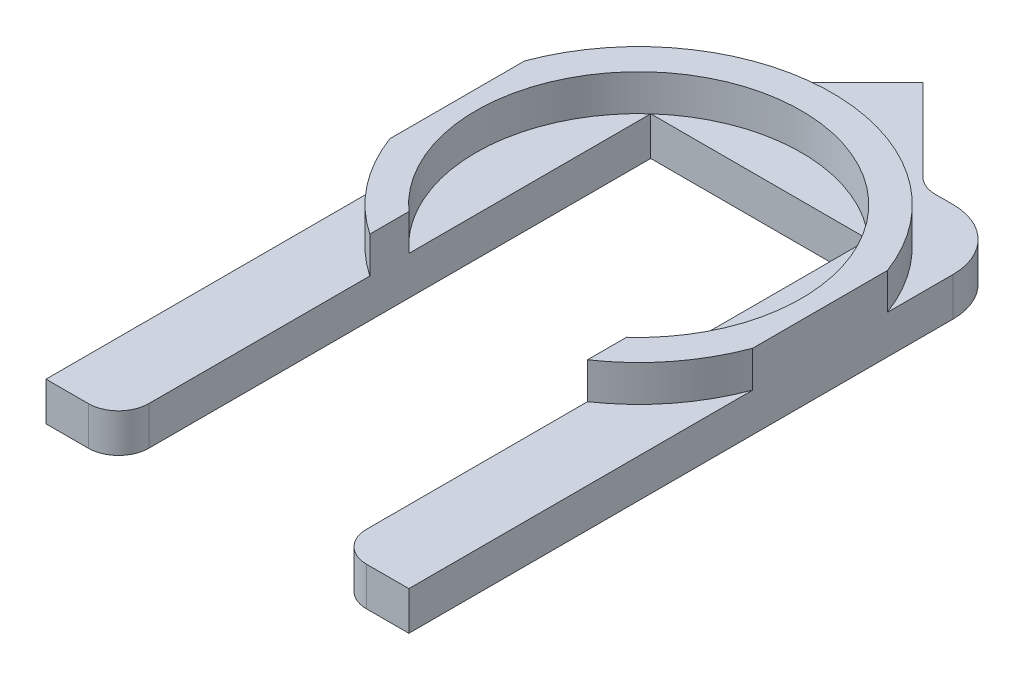
ISO-10303-21;
HEADER;
FILE_DESCRIPTION(('STEP AP214'),'2;1');
FILE_NAME('part.step','',(''),(''),'','','');
FILE_SCHEMA(('AUTOMOTIVE_DESIGN { 1 0 10303 214 1 1 1 1 }'));
ENDSEC;
DATA;
#1=APPLICATION_CONTEXT('core data for automotive mechanical design processes');
#2=APPLICATION_PROTOCOL_DEFINITION('international standard','automotive_design',2000,#1);
#3=PRODUCT_CONTEXT('',#1,'mechanical');
#4=PRODUCT('Part','Part','',(#3));
#5=PRODUCT_RELATED_PRODUCT_CATEGORY('part','',(#4));
#6=PRODUCT_DEFINITION_FORMATION('','',#4);
#7=PRODUCT_DEFINITION_CONTEXT('part definition',#1,'design');
#8=PRODUCT_DEFINITION('design','',#6,#7);
#9=PRODUCT_DEFINITION_SHAPE('','',#8);
#10=(LENGTH_UNIT() NAMED_UNIT(*) SI_UNIT(.MILLI.,.METRE.));
#11=(NAMED_UNIT(*) PLANE_ANGLE_UNIT() SI_UNIT($,.RADIAN.));
#12=(NAMED_UNIT(*) SI_UNIT($,.STERADIAN.) SOLID_ANGLE_UNIT());
#13=UNCERTAINTY_MEASURE_WITH_UNIT(LENGTH_MEASURE(1.E-05),#10,'distance_accuracy_value','');
#14=(GEOMETRIC_REPRESENTATION_CONTEXT(3) GLOBAL_UNCERTAINTY_ASSIGNED_CONTEXT((#13)) GLOBAL_UNIT_ASSIGNED_CONTEXT((#10,
#11,#12)) REPRESENTATION_CONTEXT('',''));
#15=CARTESIAN_POINT('',(0.,0.,0.));
#16=DIRECTION('',(0.,0.,1.));
#17=DIRECTION('',(1.,0.,0.));
#18=AXIS2_PLACEMENT_3D('',#15,#16,#17);
#19=CARTESIAN_POINT('',(0.,3.2,0.));
#20=DIRECTION('',(0.,-1.,0.));
#21=DIRECTION('',(0.,0.,-1.));
#22=AXIS2_PLACEMENT_3D('',#19,#20,#21);
#23=PLANE('',#22);
#24=DIRECTION('',(1.,0.,0.));
#25=VECTOR('',#24,1.);
#26=CARTESIAN_POINT('',(-15.,3.2,25.));
#27=LINE('',#26,#25);
#28=CARTESIAN_POINT('',(-15.,3.2,25.));
#29=VERTEX_POINT('',#28);
#30=CARTESIAN_POINT('',(-11.5,3.2,25.));
#31=VERTEX_POINT('',#30);
#32=EDGE_CURVE('E254',#29,#31,#27,.T.);
#33=ORIENTED_EDGE('',*,*,#32,.T.);
#34=CARTESIAN_POINT('',(-11.5,3.2,22.5));
#35=DIRECTION('',(0.,-1.,0.));
#36=DIRECTION('',(0.,0.,-1.));
#37=AXIS2_PLACEMENT_3D('',#34,#35,#36);
#38=CIRCLE('',#37,2.5);
#39=CARTESIAN_POINT('',(-8.99999999999999,3.2,22.5));
#40=VERTEX_POINT('',#39);
#41=EDGE_CURVE('E62',#31,#40,#38,.F.);
#42=ORIENTED_EDGE('',*,*,#41,.T.);
#43=DIRECTION('',(0.,0.,-1.));
#44=VECTOR('',#43,1.);
#45=CARTESIAN_POINT('',(-8.99999999999999,3.2,25.));
#46=LINE('',#45,#44);
#47=CARTESIAN_POINT('',(-8.99999999999999,3.2,4.22875655532297));
#48=VERTEX_POINT('',#47);
#49=EDGE_CURVE('E258',#40,#48,#46,.T.);
#50=ORIENTED_EDGE('',*,*,#49,.T.);
#51=CARTESIAN_POINT('',(0.,3.2,-8.99999999999999));
#52=DIRECTION('',(0.,1.,0.));
#53=DIRECTION('',(0.,0.,1.));
#54=AXIS2_PLACEMENT_3D('',#51,#52,#53);
#55=CIRCLE('',#54,16.);
#56=CARTESIAN_POINT('',(-15.,3.2,-3.43223563716993));
#57=VERTEX_POINT('',#56);
#58=EDGE_CURVE('E234',#57,#48,#55,.T.);
#59=ORIENTED_EDGE('',*,*,#58,.F.);
#60=DIRECTION('',(0.,0.,1.));
#61=VECTOR('',#60,1.);
#62=CARTESIAN_POINT('',(-15.,3.2,25.));
#63=LINE('',#62,#61);
#64=EDGE_CURVE('E249',#57,#29,#63,.T.);
#65=ORIENTED_EDGE('',*,*,#64,.T.);
#66=EDGE_LOOP('',(#33,#42,#50,#59,#65));
#67=FACE_BOUND('',#66,.T.);
#68=ADVANCED_FACE('F39',(#67),#23,.F.);
#69=DIRECTION('',(-0.70710678118654,0.,0.707106781186555));
#70=VECTOR('',#69,1.);
#71=CARTESIAN_POINT('',(0.,3.2,-32.5));
#72=LINE('',#71,#70);
#73=CARTESIAN_POINT('',(0.,3.2,-32.5));
#74=VERTEX_POINT('',#73);
#75=CARTESIAN_POINT('',(-6.76776695296624,3.2,-25.7322330470336));
#76=VERTEX_POINT('',#75);
#77=EDGE_CURVE('E283',#74,#76,#72,.T.);
#78=ORIENTED_EDGE('',*,*,#77,.T.);
#79=CARTESIAN_POINT('',(-8.53553390593262,3.2,-27.5));
#80=DIRECTION('',(0.,-1.,0.));
#81=DIRECTION('',(0.,0.,-1.));
#82=AXIS2_PLACEMENT_3D('',#79,#80,#81);
#83=CIRCLE('',#82,2.5);
#84=CARTESIAN_POINT('',(-8.53553390593262,3.2,-25.));
#85=VERTEX_POINT('',#84);
#86=EDGE_CURVE('E11',#76,#85,#83,.T.);
#87=ORIENTED_EDGE('',*,*,#86,.T.);
#88=DIRECTION('',(-1.,0.,0.));
#89=VECTOR('',#88,1.);
#90=CARTESIAN_POINT('',(-7.49999999999987,3.2,-25.));
#91=LINE('',#90,#89);
#92=CARTESIAN_POINT('',(-9.99999999999999,3.2,-25.));
#93=VERTEX_POINT('',#92);
#94=EDGE_CURVE('E246',#85,#93,#91,.T.);
#95=ORIENTED_EDGE('',*,*,#94,.T.);
#96=CARTESIAN_POINT('',(-9.99999999999999,3.2,-20.));
#97=DIRECTION('',(0.,-1.,0.));
#98=DIRECTION('',(0.,0.,-1.));
#99=AXIS2_PLACEMENT_3D('',#96,#97,#98);
#100=CIRCLE('',#99,5.);
#101=CARTESIAN_POINT('',(-15.,3.2,-20.));
#102=VERTEX_POINT('',#101);
#103=EDGE_CURVE('E359',#93,#102,#100,.F.);
#104=ORIENTED_EDGE('',*,*,#103,.T.);
#105=CARTESIAN_POINT('',(-15.,3.2,-14.56776436283));
#106=VERTEX_POINT('',#105);
#107=EDGE_CURVE('E251',#102,#106,#63,.T.);
#108=ORIENTED_EDGE('',*,*,#107,.T.);
#109=CARTESIAN_POINT('',(0.,3.2,-8.99999999999999));
#110=DIRECTION('',(0.,1.,0.));
#111=DIRECTION('',(0.,0.,1.));
#112=AXIS2_PLACEMENT_3D('',#109,#110,#111);
#113=CIRCLE('',#112,16.);
#114=CARTESIAN_POINT('',(15.,3.2,-14.56776436283));
#115=VERTEX_POINT('',#114);
#116=EDGE_CURVE('E231',#115,#106,#113,.T.);
#117=ORIENTED_EDGE('',*,*,#116,.F.);
#118=DIRECTION('',(0.,0.,-1.));
#119=VECTOR('',#118,1.);
#120=CARTESIAN_POINT('',(15.,3.2,25.));
#121=LINE('',#120,#119);
#122=CARTESIAN_POINT('',(15.,3.2,-20.));
#123=VERTEX_POINT('',#122);
#124=EDGE_CURVE('E272',#115,#123,#121,.T.);
#125=ORIENTED_EDGE('',*,*,#124,.T.);
#126=CARTESIAN_POINT('',(10.,3.2,-20.));
#127=DIRECTION('',(0.,-1.,0.));
#128=DIRECTION('',(0.,0.,-1.));
#129=AXIS2_PLACEMENT_3D('',#126,#127,#128);
#130=CIRCLE('',#129,5.);
#131=CARTESIAN_POINT('',(10.,3.2,-25.));
#132=VERTEX_POINT('',#131);
#133=EDGE_CURVE('E356',#123,#132,#130,.F.);
#134=ORIENTED_EDGE('',*,*,#133,.T.);
#135=DIRECTION('',(-1.,0.,0.));
#136=VECTOR('',#135,1.);
#137=CARTESIAN_POINT('',(15.,3.2,-25.));
#138=LINE('',#137,#136);
#139=CARTESIAN_POINT('',(8.53553390593285,3.2,-25.));
#140=VERTEX_POINT('',#139);
#141=EDGE_CURVE('E276',#132,#140,#138,.T.);
#142=ORIENTED_EDGE('',*,*,#141,.T.);
#143=CARTESIAN_POINT('',(8.53553390593286,3.2,-27.5));
#144=DIRECTION('',(0.,-1.,0.));
#145=DIRECTION('',(0.,0.,-1.));
#146=AXIS2_PLACEMENT_3D('',#143,#144,#145);
#147=CIRCLE('',#146,2.5);
#148=CARTESIAN_POINT('',(6.7677669529665,3.2,-25.7322330470336));
#149=VERTEX_POINT('',#148);
#150=EDGE_CURVE('E410',#140,#149,#147,.T.);
#151=ORIENTED_EDGE('',*,*,#150,.T.);
#152=DIRECTION('',(-0.707106781186554,0.,-0.707106781186541));
#153=VECTOR('',#152,1.);
#154=CARTESIAN_POINT('',(0.,3.2,-32.5));
#155=LINE('',#154,#153);
#156=EDGE_CURVE('E280',#149,#74,#155,.T.);
#157=ORIENTED_EDGE('',*,*,#156,.T.);
#158=EDGE_LOOP('',(#78,#87,#95,#104,#108,#117,#125,#134,#142,#151,#157));
#159=FACE_BOUND('',#158,.T.);
#160=ADVANCED_FACE('F430',(#159),#23,.F.);
#161=DIRECTION('',(0.,0.,1.));
#162=VECTOR('',#161,1.);
#163=CARTESIAN_POINT('',(9.00000000000001,3.2,25.));
#164=LINE('',#163,#162);
#165=CARTESIAN_POINT('',(9.00000000000001,3.2,4.22875655532297));
#166=VERTEX_POINT('',#165);
#167=CARTESIAN_POINT('',(9.00000000000001,3.2,22.5));
#168=VERTEX_POINT('',#167);
#169=EDGE_CURVE('E265',#166,#168,#164,.T.);
#170=ORIENTED_EDGE('',*,*,#169,.T.);
#171=CARTESIAN_POINT('',(11.5,3.2,22.5));
#172=DIRECTION('',(0.,-1.,0.));
#173=DIRECTION('',(0.,0.,-1.));
#174=AXIS2_PLACEMENT_3D('',#171,#172,#173);
#175=CIRCLE('',#174,2.5);
#176=CARTESIAN_POINT('',(11.5,3.2,25.));
#177=VERTEX_POINT('',#176);
#178=EDGE_CURVE('E396',#168,#177,#175,.F.);
#179=ORIENTED_EDGE('',*,*,#178,.T.);
#180=DIRECTION('',(1.,0.,0.));
#181=VECTOR('',#180,1.);
#182=CARTESIAN_POINT('',(9.00000000000001,3.2,25.));
#183=LINE('',#182,#181);
#184=CARTESIAN_POINT('',(15.,3.2,25.));
#185=VERTEX_POINT('',#184);
#186=EDGE_CURVE('E269',#177,#185,#183,.T.);
#187=ORIENTED_EDGE('',*,*,#186,.T.);
#188=CARTESIAN_POINT('',(15.,3.2,-3.43223563716999));
#189=VERTEX_POINT('',#188);
#190=EDGE_CURVE('E273',#185,#189,#121,.T.);
#191=ORIENTED_EDGE('',*,*,#190,.T.);
#192=CARTESIAN_POINT('',(0.,3.2,-8.99999999999999));
#193=DIRECTION('',(0.,1.,0.));
#194=DIRECTION('',(0.,0.,1.));
#195=AXIS2_PLACEMENT_3D('',#192,#193,#194);
#196=CIRCLE('',#195,16.);
#197=EDGE_CURVE('E488',#166,#189,#196,.T.);
#198=ORIENTED_EDGE('',*,*,#197,.F.);
#199=EDGE_LOOP('',(#170,#179,#187,#191,#198));
#200=FACE_BOUND('',#199,.T.);
#201=ADVANCED_FACE('F548',(#200),#23,.F.);
#202=CARTESIAN_POINT('',(0.,3.2,-8.99999999999999));
#203=DIRECTION('',(0.,-1.,0.));
#204=DIRECTION('',(0.,0.,1.));
#205=AXIS2_PLACEMENT_3D('',#202,#203,#204);
#206=CIRCLE('',#205,13.4536240470737);
#207=CARTESIAN_POINT('',(-8.99999999999999,3.2,1.00000000000002));
#208=VERTEX_POINT('',#207);
#209=CARTESIAN_POINT('',(-9.,3.2,-19.));
#210=VERTEX_POINT('',#209);
#211=EDGE_CURVE('E483',#208,#210,#206,.T.);
#212=ORIENTED_EDGE('',*,*,#211,.F.);
#213=EDGE_CURVE('E257',#208,#210,#46,.T.);
#214=ORIENTED_EDGE('',*,*,#213,.T.);
#215=EDGE_LOOP('',(#212,#214));
#216=FACE_BOUND('',#215,.T.);
#217=ADVANCED_FACE('F558',(#216),#23,.F.);
#218=CARTESIAN_POINT('',(9.,3.2,-19.));
#219=VERTEX_POINT('',#218);
#220=EDGE_CURVE('E345',#210,#219,#206,.T.);
#221=ORIENTED_EDGE('',*,*,#220,.F.);
#222=DIRECTION('',(1.,0.,0.));
#223=VECTOR('',#222,1.);
#224=CARTESIAN_POINT('',(-9.,3.2,-19.));
#225=LINE('',#224,#223);
#226=EDGE_CURVE('E261',#210,#219,#225,.T.);
#227=ORIENTED_EDGE('',*,*,#226,.T.);
#228=EDGE_LOOP('',(#221,#227));
#229=FACE_BOUND('',#228,.T.);
#230=ADVANCED_FACE('F552',(#229),#23,.F.);
#231=CARTESIAN_POINT('',(9.00000000000001,3.2,1.00000000000001));
#232=VERTEX_POINT('',#231);
#233=EDGE_CURVE('E339',#219,#232,#206,.T.);
#234=ORIENTED_EDGE('',*,*,#233,.F.);
#235=EDGE_CURVE('E266',#219,#232,#164,.T.);
#236=ORIENTED_EDGE('',*,*,#235,.T.);
#237=EDGE_LOOP('',(#234,#236));
#238=FACE_BOUND('',#237,.T.);
#239=ADVANCED_FACE('F544',(#238),#23,.F.);
#240=CARTESIAN_POINT('',(-7.49999999999987,3.2,-25.));
#241=DIRECTION('',(0.,0.,1.));
#242=DIRECTION('',(1.,0.,0.));
#243=AXIS2_PLACEMENT_3D('',#240,#241,#242);
#244=PLANE('',#243);
#245=ORIENTED_EDGE('',*,*,#94,.F.);
#246=DIRECTION('',(0.,-1.,0.));
#247=VECTOR('',#246,1.);
#248=CARTESIAN_POINT('',(-8.53553390593262,0.,-25.));
#249=LINE('',#248,#247);
#250=CARTESIAN_POINT('',(-8.53553390593262,0.,-25.));
#251=VERTEX_POINT('',#250);
#252=EDGE_CURVE('E376',#85,#251,#249,.T.);
#253=ORIENTED_EDGE('',*,*,#252,.T.);
#254=DIRECTION('',(-1.,0.,0.));
#255=VECTOR('',#254,1.);
#256=CARTESIAN_POINT('',(-7.49999999999987,0.,-25.));
#257=LINE('',#256,#255);
#258=CARTESIAN_POINT('',(-9.99999999999999,0.,-25.));
#259=VERTEX_POINT('',#258);
#260=EDGE_CURVE('E236',#251,#259,#257,.T.);
#261=ORIENTED_EDGE('',*,*,#260,.T.);
#262=DIRECTION('',(0.,-1.,0.));
#263=VECTOR('',#262,1.);
#264=CARTESIAN_POINT('',(-9.99999999999999,3.2,-25.));
#265=LINE('',#264,#263);
#266=EDGE_CURVE('E352',#259,#93,#265,.F.);
#267=ORIENTED_EDGE('',*,*,#266,.T.);
#268=EDGE_LOOP('',(#245,#253,#261,#267));
#269=FACE_BOUND('',#268,.T.);
#270=ADVANCED_FACE('F432',(#269),#244,.F.);
#271=CARTESIAN_POINT('',(-15.,3.2,25.));
#272=DIRECTION('',(1.,0.,0.));
#273=DIRECTION('',(0.,0.,-1.));
#274=AXIS2_PLACEMENT_3D('',#271,#272,#273);
#275=PLANE('',#274);
#276=ORIENTED_EDGE('',*,*,#107,.F.);
#277=DIRECTION('',(0.,-1.,0.));
#278=VECTOR('',#277,1.);
#279=CARTESIAN_POINT('',(-15.,3.2,-20.));
#280=LINE('',#279,#278);
#281=CARTESIAN_POINT('',(-15.,0.,-20.));
#282=VERTEX_POINT('',#281);
#283=EDGE_CURVE('E340',#102,#282,#280,.T.);
#284=ORIENTED_EDGE('',*,*,#283,.T.);
#285=DIRECTION('',(0.,0.,1.));
#286=VECTOR('',#285,1.);
#287=CARTESIAN_POINT('',(-15.,0.,25.));
#288=LINE('',#287,#286);
#289=CARTESIAN_POINT('',(-15.,0.,25.));
#290=VERTEX_POINT('',#289);
#291=EDGE_CURVE('E240',#282,#290,#288,.T.);
#292=ORIENTED_EDGE('',*,*,#291,.T.);
#293=DIRECTION('',(0.,-1.,0.));
#294=VECTOR('',#293,1.);
#295=CARTESIAN_POINT('',(-15.,3.2,25.));
#296=LINE('',#295,#294);
#297=EDGE_CURVE('E335',#29,#290,#296,.T.);
#298=ORIENTED_EDGE('',*,*,#297,.F.);
#299=ORIENTED_EDGE('',*,*,#64,.F.);
#300=DIRECTION('',(0.,-1.,0.));
#301=VECTOR('',#300,1.);
#302=CARTESIAN_POINT('',(-15.,6.2,-3.43223563716993));
#303=LINE('',#302,#301);
#304=CARTESIAN_POINT('',(-15.,6.2,-3.43223563716993));
#305=VERTEX_POINT('',#304);
#306=EDGE_CURVE('E450',#305,#57,#303,.T.);
#307=ORIENTED_EDGE('',*,*,#306,.F.);
#308=DIRECTION('',(0.,0.,1.));
#309=VECTOR('',#308,1.);
#310=CARTESIAN_POINT('',(-15.,6.2,-14.56776436283));
#311=LINE('',#310,#309);
#312=CARTESIAN_POINT('',(-15.,6.2,-14.56776436283));
#313=VERTEX_POINT('',#312);
#314=EDGE_CURVE('E226',#313,#305,#311,.T.);
#315=ORIENTED_EDGE('',*,*,#314,.F.);
#316=DIRECTION('',(0.,-1.,0.));
#317=VECTOR('',#316,1.);
#318=CARTESIAN_POINT('',(-15.,6.2,-14.56776436283));
#319=LINE('',#318,#317);
#320=EDGE_CURVE('E445',#313,#106,#319,.T.);
#321=ORIENTED_EDGE('',*,*,#320,.T.);
#322=EDGE_LOOP('',(#276,#284,#292,#298,#299,#307,#315,#321));
#323=FACE_BOUND('',#322,.T.);
#324=ADVANCED_FACE('F442',(#323),#275,.F.);
#325=CARTESIAN_POINT('',(-15.,3.2,25.));
#326=DIRECTION('',(0.,0.,-1.));
#327=DIRECTION('',(-1.,0.,0.));
#328=AXIS2_PLACEMENT_3D('',#325,#326,#327);
#329=PLANE('',#328);
#330=DIRECTION('',(1.,0.,0.));
#331=VECTOR('',#330,1.);
#332=CARTESIAN_POINT('',(-15.,0.,25.));
#333=LINE('',#332,#331);
#334=CARTESIAN_POINT('',(-11.5,0.,25.));
#335=VERTEX_POINT('',#334);
#336=EDGE_CURVE('E290',#290,#335,#333,.T.);
#337=ORIENTED_EDGE('',*,*,#336,.T.);
#338=DIRECTION('',(0.,-1.,0.));
#339=VECTOR('',#338,1.);
#340=CARTESIAN_POINT('',(-11.5,3.2,25.));
#341=LINE('',#340,#339);
#342=EDGE_CURVE('E55',#335,#31,#341,.F.);
#343=ORIENTED_EDGE('',*,*,#342,.T.);
#344=ORIENTED_EDGE('',*,*,#32,.F.);
#345=ORIENTED_EDGE('',*,*,#297,.T.);
#346=EDGE_LOOP('',(#337,#343,#344,#345));
#347=FACE_BOUND('',#346,.T.);
#348=ADVANCED_FACE('F532',(#347),#329,.F.);
#349=CARTESIAN_POINT('',(-8.99999999999999,3.2,25.));
#350=DIRECTION('',(-1.,0.,0.));
#351=DIRECTION('',(0.,0.,1.));
#352=AXIS2_PLACEMENT_3D('',#349,#350,#351);
#353=PLANE('',#352);
#354=ORIENTED_EDGE('',*,*,#49,.F.);
#355=DIRECTION('',(0.,-1.,0.));
#356=VECTOR('',#355,1.);
#357=CARTESIAN_POINT('',(-8.99999999999999,3.2,22.5));
#358=LINE('',#357,#356);
#359=CARTESIAN_POINT('',(-8.99999999999999,0.,22.5));
#360=VERTEX_POINT('',#359);
#361=EDGE_CURVE('E399',#40,#360,#358,.T.);
#362=ORIENTED_EDGE('',*,*,#361,.T.);
#363=DIRECTION('',(0.,0.,-1.));
#364=VECTOR('',#363,1.);
#365=CARTESIAN_POINT('',(-8.99999999999999,0.,25.));
#366=LINE('',#365,#364);
#367=CARTESIAN_POINT('',(-9.,0.,-19.));
#368=VERTEX_POINT('',#367);
#369=EDGE_CURVE('E293',#360,#368,#366,.T.);
#370=ORIENTED_EDGE('',*,*,#369,.T.);
#371=DIRECTION('',(0.,-1.,0.));
#372=VECTOR('',#371,1.);
#373=CARTESIAN_POINT('',(-9.,3.2,-19.));
#374=LINE('',#373,#372);
#375=EDGE_CURVE('E331',#210,#368,#374,.T.);
#376=ORIENTED_EDGE('',*,*,#375,.F.);
#377=ORIENTED_EDGE('',*,*,#213,.F.);
#378=DIRECTION('',(0.,-1.,0.));
#379=VECTOR('',#378,1.);
#380=CARTESIAN_POINT('',(-8.99999999999999,6.2,1.00000000000002));
#381=LINE('',#380,#379);
#382=CARTESIAN_POINT('',(-8.99999999999999,6.2,1.00000000000002));
#383=VERTEX_POINT('',#382);
#384=EDGE_CURVE('E216',#383,#208,#381,.T.);
#385=ORIENTED_EDGE('',*,*,#384,.F.);
#386=DIRECTION('',(0.,0.,-1.));
#387=VECTOR('',#386,1.);
#388=CARTESIAN_POINT('',(-8.99999999999999,6.2,4.22875655532297));
#389=LINE('',#388,#387);
#390=CARTESIAN_POINT('',(-8.99999999999999,6.2,4.22875655532297));
#391=VERTEX_POINT('',#390);
#392=EDGE_CURVE('E208',#391,#383,#389,.T.);
#393=ORIENTED_EDGE('',*,*,#392,.F.);
#394=DIRECTION('',(0.,-1.,0.));
#395=VECTOR('',#394,1.);
#396=CARTESIAN_POINT('',(-8.99999999999999,6.2,4.22875655532297));
#397=LINE('',#396,#395);
#398=EDGE_CURVE('E212',#391,#48,#397,.T.);
#399=ORIENTED_EDGE('',*,*,#398,.T.);
#400=EDGE_LOOP('',(#354,#362,#370,#376,#377,#385,#393,#399));
#401=FACE_BOUND('',#400,.T.);
#402=ADVANCED_FACE('F210',(#401),#353,.F.);
#403=CARTESIAN_POINT('',(-9.,3.2,-19.));
#404=DIRECTION('',(0.,0.,-1.));
#405=DIRECTION('',(-1.,0.,0.));
#406=AXIS2_PLACEMENT_3D('',#403,#404,#405);
#407=PLANE('',#406);
#408=DIRECTION('',(1.,0.,0.));
#409=VECTOR('',#408,1.);
#410=CARTESIAN_POINT('',(-9.,0.,-19.));
#411=LINE('',#410,#409);
#412=CARTESIAN_POINT('',(9.,0.,-19.));
#413=VERTEX_POINT('',#412);
#414=EDGE_CURVE('E296',#368,#413,#411,.T.);
#415=ORIENTED_EDGE('',*,*,#414,.T.);
#416=DIRECTION('',(0.,-1.,0.));
#417=VECTOR('',#416,1.);
#418=CARTESIAN_POINT('',(9.,3.2,-19.));
#419=LINE('',#418,#417);
#420=EDGE_CURVE('E327',#219,#413,#419,.T.);
#421=ORIENTED_EDGE('',*,*,#420,.F.);
#422=ORIENTED_EDGE('',*,*,#226,.F.);
#423=ORIENTED_EDGE('',*,*,#375,.T.);
#424=EDGE_LOOP('',(#415,#421,#422,#423));
#425=FACE_BOUND('',#424,.T.);
#426=ADVANCED_FACE('F539',(#425),#407,.F.);
#427=CARTESIAN_POINT('',(9.00000000000001,3.2,25.));
#428=DIRECTION('',(1.,0.,0.));
#429=DIRECTION('',(0.,0.,-1.));
#430=AXIS2_PLACEMENT_3D('',#427,#428,#429);
#431=PLANE('',#430);
#432=DIRECTION('',(0.,0.,1.));
#433=VECTOR('',#432,1.);
#434=CARTESIAN_POINT('',(9.00000000000001,0.,25.));
#435=LINE('',#434,#433);
#436=CARTESIAN_POINT('',(9.00000000000001,0.,22.5));
#437=VERTEX_POINT('',#436);
#438=EDGE_CURVE('E299',#413,#437,#435,.T.);
#439=ORIENTED_EDGE('',*,*,#438,.T.);
#440=DIRECTION('',(0.,-1.,0.));
#441=VECTOR('',#440,1.);
#442=CARTESIAN_POINT('',(9.00000000000001,3.2,22.5));
#443=LINE('',#442,#441);
#444=EDGE_CURVE('E393',#437,#168,#443,.F.);
#445=ORIENTED_EDGE('',*,*,#444,.T.);
#446=ORIENTED_EDGE('',*,*,#169,.F.);
#447=DIRECTION('',(0.,-1.,0.));
#448=VECTOR('',#447,1.);
#449=CARTESIAN_POINT('',(9.00000000000001,6.2,4.22875655532296));
#450=LINE('',#449,#448);
#451=CARTESIAN_POINT('',(9.00000000000001,6.2,4.22875655532296));
#452=VERTEX_POINT('',#451);
#453=EDGE_CURVE('E463',#452,#166,#450,.T.);
#454=ORIENTED_EDGE('',*,*,#453,.F.);
#455=DIRECTION('',(0.,0.,1.));
#456=VECTOR('',#455,1.);
#457=CARTESIAN_POINT('',(9.00000000000001,6.2,1.00000000000001));
#458=LINE('',#457,#456);
#459=CARTESIAN_POINT('',(9.00000000000001,6.2,1.00000000000001));
#460=VERTEX_POINT('',#459);
#461=EDGE_CURVE('E475',#460,#452,#458,.T.);
#462=ORIENTED_EDGE('',*,*,#461,.F.);
#463=DIRECTION('',(0.,-1.,0.));
#464=VECTOR('',#463,1.);
#465=CARTESIAN_POINT('',(9.00000000000001,6.2,1.00000000000001));
#466=LINE('',#465,#464);
#467=EDGE_CURVE('E242',#460,#232,#466,.T.);
#468=ORIENTED_EDGE('',*,*,#467,.T.);
#469=ORIENTED_EDGE('',*,*,#235,.F.);
#470=ORIENTED_EDGE('',*,*,#420,.T.);
#471=EDGE_LOOP('',(#439,#445,#446,#454,#462,#468,#469,#470));
#472=FACE_BOUND('',#471,.T.);
#473=ADVANCED_FACE('F472',(#472),#431,.F.);
#474=CARTESIAN_POINT('',(9.00000000000001,3.2,25.));
#475=DIRECTION('',(0.,0.,-1.));
#476=DIRECTION('',(-1.,0.,0.));
#477=AXIS2_PLACEMENT_3D('',#474,#475,#476);
#478=PLANE('',#477);
#479=ORIENTED_EDGE('',*,*,#186,.F.);
#480=DIRECTION('',(0.,-1.,0.));
#481=VECTOR('',#480,1.);
#482=CARTESIAN_POINT('',(11.5,3.2,25.));
#483=LINE('',#482,#481);
#484=CARTESIAN_POINT('',(11.5,0.,25.));
#485=VERTEX_POINT('',#484);
#486=EDGE_CURVE('E383',#177,#485,#483,.T.);
#487=ORIENTED_EDGE('',*,*,#486,.T.);
#488=DIRECTION('',(1.,0.,0.));
#489=VECTOR('',#488,1.);
#490=CARTESIAN_POINT('',(9.00000000000001,0.,25.));
#491=LINE('',#490,#489);
#492=CARTESIAN_POINT('',(15.,0.,25.));
#493=VERTEX_POINT('',#492);
#494=EDGE_CURVE('E303',#485,#493,#491,.T.);
#495=ORIENTED_EDGE('',*,*,#494,.T.);
#496=DIRECTION('',(0.,-1.,0.));
#497=VECTOR('',#496,1.);
#498=CARTESIAN_POINT('',(15.,3.2,25.));
#499=LINE('',#498,#497);
#500=EDGE_CURVE('E323',#185,#493,#499,.T.);
#501=ORIENTED_EDGE('',*,*,#500,.F.);
#502=EDGE_LOOP('',(#479,#487,#495,#501));
#503=FACE_BOUND('',#502,.T.);
#504=ADVANCED_FACE('F579',(#503),#478,.F.);
#505=CARTESIAN_POINT('',(15.,3.2,25.));
#506=DIRECTION('',(-1.,0.,0.));
#507=DIRECTION('',(0.,0.,1.));
#508=AXIS2_PLACEMENT_3D('',#505,#506,#507);
#509=PLANE('',#508);
#510=DIRECTION('',(0.,0.,-1.));
#511=VECTOR('',#510,1.);
#512=CARTESIAN_POINT('',(15.,0.,25.));
#513=LINE('',#512,#511);
#514=CARTESIAN_POINT('',(15.,0.,-20.));
#515=VERTEX_POINT('',#514);
#516=EDGE_CURVE('E306',#493,#515,#513,.T.);
#517=ORIENTED_EDGE('',*,*,#516,.T.);
#518=DIRECTION('',(0.,-1.,0.));
#519=VECTOR('',#518,1.);
#520=CARTESIAN_POINT('',(15.,3.2,-20.));
#521=LINE('',#520,#519);
#522=EDGE_CURVE('E366',#515,#123,#521,.F.);
#523=ORIENTED_EDGE('',*,*,#522,.T.);
#524=ORIENTED_EDGE('',*,*,#124,.F.);
#525=DIRECTION('',(0.,-1.,0.));
#526=VECTOR('',#525,1.);
#527=CARTESIAN_POINT('',(15.,6.2,-14.56776436283));
#528=LINE('',#527,#526);
#529=CARTESIAN_POINT('',(15.,6.2,-14.56776436283));
#530=VERTEX_POINT('',#529);
#531=EDGE_CURVE('E449',#530,#115,#528,.T.);
#532=ORIENTED_EDGE('',*,*,#531,.F.);
#533=DIRECTION('',(0.,0.,-1.));
#534=VECTOR('',#533,1.);
#535=CARTESIAN_POINT('',(15.,6.2,-14.56776436283));
#536=LINE('',#535,#534);
#537=CARTESIAN_POINT('',(15.,6.2,-3.43223563716999));
#538=VERTEX_POINT('',#537);
#539=EDGE_CURVE('E498',#538,#530,#536,.T.);
#540=ORIENTED_EDGE('',*,*,#539,.F.);
#541=DIRECTION('',(0.,-1.,0.));
#542=VECTOR('',#541,1.);
#543=CARTESIAN_POINT('',(15.,6.2,-3.43223563716999));
#544=LINE('',#543,#542);
#545=EDGE_CURVE('E455',#538,#189,#544,.T.);
#546=ORIENTED_EDGE('',*,*,#545,.T.);
#547=ORIENTED_EDGE('',*,*,#190,.F.);
#548=ORIENTED_EDGE('',*,*,#500,.T.);
#549=EDGE_LOOP('',(#517,#523,#524,#532,#540,#546,#547,#548));
#550=FACE_BOUND('',#549,.T.);
#551=ADVANCED_FACE('F517',(#550),#509,.F.);
#552=CARTESIAN_POINT('',(15.,3.2,-25.));
#553=DIRECTION('',(0.,0.,1.));
#554=DIRECTION('',(1.,0.,0.));
#555=AXIS2_PLACEMENT_3D('',#552,#553,#554);
#556=PLANE('',#555);
#557=DIRECTION('',(-1.,0.,0.));
#558=VECTOR('',#557,1.);
#559=CARTESIAN_POINT('',(15.,0.,-25.));
#560=LINE('',#559,#558);
#561=CARTESIAN_POINT('',(10.,0.,-25.));
#562=VERTEX_POINT('',#561);
#563=CARTESIAN_POINT('',(8.53553390593285,0.,-25.));
#564=VERTEX_POINT('',#563);
#565=EDGE_CURVE('E310',#562,#564,#560,.T.);
#566=ORIENTED_EDGE('',*,*,#565,.T.);
#567=DIRECTION('',(0.,-1.,0.));
#568=VECTOR('',#567,1.);
#569=CARTESIAN_POINT('',(8.53553390593285,3.2,-25.));
#570=LINE('',#569,#568);
#571=EDGE_CURVE('E373',#564,#140,#570,.F.);
#572=ORIENTED_EDGE('',*,*,#571,.T.);
#573=ORIENTED_EDGE('',*,*,#141,.F.);
#574=DIRECTION('',(0.,-1.,0.));
#575=VECTOR('',#574,1.);
#576=CARTESIAN_POINT('',(10.,3.2,-25.));
#577=LINE('',#576,#575);
#578=EDGE_CURVE('E362',#132,#562,#577,.T.);
#579=ORIENTED_EDGE('',*,*,#578,.T.);
#580=EDGE_LOOP('',(#566,#572,#573,#579));
#581=FACE_BOUND('',#580,.T.);
#582=ADVANCED_FACE('F588',(#581),#556,.F.);
#583=CARTESIAN_POINT('',(0.,3.2,-32.5));
#584=DIRECTION('',(-0.707106781186541,0.,0.707106781186554));
#585=DIRECTION('',(0.707106781186554,0.,0.707106781186541));
#586=AXIS2_PLACEMENT_3D('',#583,#584,#585);
#587=PLANE('',#586);
#588=ORIENTED_EDGE('',*,*,#156,.F.);
#589=DIRECTION('',(0.,-1.,0.));
#590=VECTOR('',#589,1.);
#591=CARTESIAN_POINT('',(6.7677669529665,0.,-25.7322330470336));
#592=LINE('',#591,#590);
#593=CARTESIAN_POINT('',(6.7677669529665,0.,-25.7322330470336));
#594=VERTEX_POINT('',#593);
#595=EDGE_CURVE('E369',#149,#594,#592,.T.);
#596=ORIENTED_EDGE('',*,*,#595,.T.);
#597=DIRECTION('',(-0.707106781186554,0.,-0.707106781186541));
#598=VECTOR('',#597,1.);
#599=CARTESIAN_POINT('',(0.,0.,-32.5));
#600=LINE('',#599,#598);
#601=CARTESIAN_POINT('',(0.,0.,-32.5));
#602=VERTEX_POINT('',#601);
#603=EDGE_CURVE('E314',#594,#602,#600,.T.);
#604=ORIENTED_EDGE('',*,*,#603,.T.);
#605=DIRECTION('',(0.,-1.,0.));
#606=VECTOR('',#605,1.);
#607=CARTESIAN_POINT('',(0.,3.2,-32.5));
#608=LINE('',#607,#606);
#609=EDGE_CURVE('E286',#74,#602,#608,.T.);
#610=ORIENTED_EDGE('',*,*,#609,.F.);
#611=EDGE_LOOP('',(#588,#596,#604,#610));
#612=FACE_BOUND('',#611,.T.);
#613=ADVANCED_FACE('F596',(#612),#587,.F.);
#614=CARTESIAN_POINT('',(0.,3.2,-32.5));
#615=DIRECTION('',(0.707106781186555,0.,0.70710678118654));
#616=DIRECTION('',(0.70710678118654,0.,-0.707106781186555));
#617=AXIS2_PLACEMENT_3D('',#614,#615,#616);
#618=PLANE('',#617);
#619=DIRECTION('',(-0.70710678118654,0.,0.707106781186555));
#620=VECTOR('',#619,1.);
#621=CARTESIAN_POINT('',(0.,0.,-32.5));
#622=LINE('',#621,#620);
#623=CARTESIAN_POINT('',(-6.76776695296624,0.,-25.7322330470336));
#624=VERTEX_POINT('',#623);
#625=EDGE_CURVE('E250',#602,#624,#622,.T.);
#626=ORIENTED_EDGE('',*,*,#625,.T.);
#627=DIRECTION('',(0.,-1.,0.));
#628=VECTOR('',#627,1.);
#629=CARTESIAN_POINT('',(-6.76776695296624,3.2,-25.7322330470336));
#630=LINE('',#629,#628);
#631=EDGE_CURVE('E380',#624,#76,#630,.F.);
#632=ORIENTED_EDGE('',*,*,#631,.T.);
#633=ORIENTED_EDGE('',*,*,#77,.F.);
#634=ORIENTED_EDGE('',*,*,#609,.T.);
#635=EDGE_LOOP('',(#626,#632,#633,#634));
#636=FACE_BOUND('',#635,.T.);
#637=ADVANCED_FACE('F423',(#636),#618,.F.);
#638=CARTESIAN_POINT('',(0.,0.,0.));
#639=DIRECTION('',(0.,-1.,0.));
#640=DIRECTION('',(0.,0.,-1.));
#641=AXIS2_PLACEMENT_3D('',#638,#639,#640);
#642=PLANE('',#641);
#643=ORIENTED_EDGE('',*,*,#494,.F.);
#644=CARTESIAN_POINT('',(11.5,0.,22.5));
#645=DIRECTION('',(0.,-1.,0.));
#646=DIRECTION('',(0.,0.,-1.));
#647=AXIS2_PLACEMENT_3D('',#644,#645,#646);
#648=CIRCLE('',#647,2.5);
#649=EDGE_CURVE('E390',#485,#437,#648,.T.);
#650=ORIENTED_EDGE('',*,*,#649,.T.);
#651=ORIENTED_EDGE('',*,*,#438,.F.);
#652=ORIENTED_EDGE('',*,*,#414,.F.);
#653=ORIENTED_EDGE('',*,*,#369,.F.);
#654=CARTESIAN_POINT('',(-11.5,0.,22.5));
#655=DIRECTION('',(0.,-1.,0.));
#656=DIRECTION('',(0.,0.,-1.));
#657=AXIS2_PLACEMENT_3D('',#654,#655,#656);
#658=CIRCLE('',#657,2.5);
#659=EDGE_CURVE('E387',#360,#335,#658,.T.);
#660=ORIENTED_EDGE('',*,*,#659,.T.);
#661=ORIENTED_EDGE('',*,*,#336,.F.);
#662=ORIENTED_EDGE('',*,*,#291,.F.);
#663=CARTESIAN_POINT('',(-9.99999999999999,0.,-20.));
#664=DIRECTION('',(0.,-1.,0.));
#665=DIRECTION('',(0.,0.,-1.));
#666=AXIS2_PLACEMENT_3D('',#663,#664,#665);
#667=CIRCLE('',#666,5.);
#668=EDGE_CURVE('E348',#282,#259,#667,.T.);
#669=ORIENTED_EDGE('',*,*,#668,.T.);
#670=ORIENTED_EDGE('',*,*,#260,.F.);
#671=CARTESIAN_POINT('',(-8.53553390593262,0.,-27.5));
#672=DIRECTION('',(0.,-1.,0.));
#673=DIRECTION('',(0.,0.,-1.));
#674=AXIS2_PLACEMENT_3D('',#671,#672,#673);
#675=CIRCLE('',#674,2.5);
#676=EDGE_CURVE('E48',#251,#624,#675,.F.);
#677=ORIENTED_EDGE('',*,*,#676,.T.);
#678=ORIENTED_EDGE('',*,*,#625,.F.);
#679=ORIENTED_EDGE('',*,*,#603,.F.);
#680=CARTESIAN_POINT('',(8.53553390593286,0.,-27.5));
#681=DIRECTION('',(0.,-1.,0.));
#682=DIRECTION('',(0.,0.,-1.));
#683=AXIS2_PLACEMENT_3D('',#680,#681,#682);
#684=CIRCLE('',#683,2.5);
#685=EDGE_CURVE('E407',#594,#564,#684,.F.);
#686=ORIENTED_EDGE('',*,*,#685,.T.);
#687=ORIENTED_EDGE('',*,*,#565,.F.);
#688=CARTESIAN_POINT('',(10.,0.,-20.));
#689=DIRECTION('',(0.,-1.,0.));
#690=DIRECTION('',(0.,0.,-1.));
#691=AXIS2_PLACEMENT_3D('',#688,#689,#690);
#692=CIRCLE('',#691,5.);
#693=EDGE_CURVE('E344',#562,#515,#692,.T.);
#694=ORIENTED_EDGE('',*,*,#693,.T.);
#695=ORIENTED_EDGE('',*,*,#516,.F.);
#696=EDGE_LOOP('',(#643,#650,#651,#652,#653,#660,#661,#662,#669,#670,#677,#678,#679,#686,#687,
#694,#695));
#697=FACE_BOUND('',#696,.T.);
#698=ADVANCED_FACE('F417',(#697),#642,.T.);
#699=CARTESIAN_POINT('',(0.,6.2,-8.99999999999999));
#700=DIRECTION('',(0.,-1.,0.));
#701=DIRECTION('',(0.,0.,-1.));
#702=AXIS2_PLACEMENT_3D('',#699,#700,#701);
#703=CYLINDRICAL_SURFACE('',#702,16.);
#704=ORIENTED_EDGE('',*,*,#58,.T.);
#705=ORIENTED_EDGE('',*,*,#398,.F.);
#706=CARTESIAN_POINT('',(0.,6.2,-8.99999999999999));
#707=DIRECTION('',(0.,1.,0.));
#708=DIRECTION('',(0.,0.,1.));
#709=AXIS2_PLACEMENT_3D('',#706,#707,#708);
#710=CIRCLE('',#709,16.);
#711=EDGE_CURVE('E221',#305,#391,#710,.T.);
#712=ORIENTED_EDGE('',*,*,#711,.F.);
#713=ORIENTED_EDGE('',*,*,#306,.T.);
#714=EDGE_LOOP('',(#704,#705,#712,#713));
#715=FACE_BOUND('',#714,.T.);
#716=ADVANCED_FACE('F233',(#715),#703,.T.);
#717=CARTESIAN_POINT('',(0.,6.2,-8.99999999999999));
#718=DIRECTION('',(0.,-1.,0.));
#719=DIRECTION('',(0.,0.,-1.));
#720=AXIS2_PLACEMENT_3D('',#717,#718,#719);
#721=CYLINDRICAL_SURFACE('',#720,13.4536240470737);
#722=ORIENTED_EDGE('',*,*,#211,.T.);
#723=ORIENTED_EDGE('',*,*,#220,.T.);
#724=ORIENTED_EDGE('',*,*,#233,.T.);
#725=ORIENTED_EDGE('',*,*,#467,.F.);
#726=CARTESIAN_POINT('',(0.,6.2,-8.99999999999999));
#727=DIRECTION('',(0.,-1.,0.));
#728=DIRECTION('',(0.,0.,1.));
#729=AXIS2_PLACEMENT_3D('',#726,#727,#728);
#730=CIRCLE('',#729,13.4536240470737);
#731=EDGE_CURVE('E220',#383,#460,#730,.T.);
#732=ORIENTED_EDGE('',*,*,#731,.F.);
#733=ORIENTED_EDGE('',*,*,#384,.T.);
#734=EDGE_LOOP('',(#722,#723,#724,#725,#732,#733));
#735=FACE_BOUND('',#734,.T.);
#736=ADVANCED_FACE('F479',(#735),#721,.F.);
#737=CARTESIAN_POINT('',(0.,6.2,-8.99999999999999));
#738=DIRECTION('',(0.,-1.,0.));
#739=DIRECTION('',(0.,0.,-1.));
#740=AXIS2_PLACEMENT_3D('',#737,#738,#739);
#741=CYLINDRICAL_SURFACE('',#740,16.);
#742=ORIENTED_EDGE('',*,*,#197,.T.);
#743=ORIENTED_EDGE('',*,*,#545,.F.);
#744=CARTESIAN_POINT('',(0.,6.2,-8.99999999999999));
#745=DIRECTION('',(0.,1.,0.));
#746=DIRECTION('',(0.,0.,1.));
#747=AXIS2_PLACEMENT_3D('',#744,#745,#746);
#748=CIRCLE('',#747,16.);
#749=EDGE_CURVE('E501',#452,#538,#748,.T.);
#750=ORIENTED_EDGE('',*,*,#749,.F.);
#751=ORIENTED_EDGE('',*,*,#453,.T.);
#752=EDGE_LOOP('',(#742,#743,#750,#751));
#753=FACE_BOUND('',#752,.T.);
#754=ADVANCED_FACE('F512',(#753),#741,.T.);
#755=CARTESIAN_POINT('',(0.,6.2,-8.99999999999999));
#756=DIRECTION('',(0.,-1.,0.));
#757=DIRECTION('',(0.,0.,-1.));
#758=AXIS2_PLACEMENT_3D('',#755,#756,#757);
#759=CYLINDRICAL_SURFACE('',#758,16.);
#760=ORIENTED_EDGE('',*,*,#116,.T.);
#761=ORIENTED_EDGE('',*,*,#320,.F.);
#762=CARTESIAN_POINT('',(0.,6.2,-8.99999999999999));
#763=DIRECTION('',(0.,1.,0.));
#764=DIRECTION('',(0.,0.,1.));
#765=AXIS2_PLACEMENT_3D('',#762,#763,#764);
#766=CIRCLE('',#765,16.);
#767=EDGE_CURVE('E495',#530,#313,#766,.T.);
#768=ORIENTED_EDGE('',*,*,#767,.F.);
#769=ORIENTED_EDGE('',*,*,#531,.T.);
#770=EDGE_LOOP('',(#760,#761,#768,#769));
#771=FACE_BOUND('',#770,.T.);
#772=ADVANCED_FACE('F519',(#771),#759,.T.);
#773=CARTESIAN_POINT('',(0.,6.2,-8.99999999999999));
#774=DIRECTION('',(0.,1.,0.));
#775=DIRECTION('',(0.,0.,1.));
#776=AXIS2_PLACEMENT_3D('',#773,#774,#775);
#777=PLANE('',#776);
#778=ORIENTED_EDGE('',*,*,#711,.T.);
#779=ORIENTED_EDGE('',*,*,#392,.T.);
#780=ORIENTED_EDGE('',*,*,#731,.T.);
#781=ORIENTED_EDGE('',*,*,#461,.T.);
#782=ORIENTED_EDGE('',*,*,#749,.T.);
#783=ORIENTED_EDGE('',*,*,#539,.T.);
#784=ORIENTED_EDGE('',*,*,#767,.T.);
#785=ORIENTED_EDGE('',*,*,#314,.T.);
#786=EDGE_LOOP('',(#778,#779,#780,#781,#782,#783,#784,#785));
#787=FACE_BOUND('',#786,.T.);
#788=ADVANCED_FACE('F224',(#787),#777,.T.);
#789=CARTESIAN_POINT('',(-9.99999999999999,3.2,-20.));
#790=DIRECTION('',(0.,-1.,0.));
#791=DIRECTION('',(0.,0.,-1.));
#792=AXIS2_PLACEMENT_3D('',#789,#790,#791);
#793=CYLINDRICAL_SURFACE('',#792,5.);
#794=ORIENTED_EDGE('',*,*,#103,.F.);
#795=ORIENTED_EDGE('',*,*,#266,.F.);
#796=ORIENTED_EDGE('',*,*,#668,.F.);
#797=ORIENTED_EDGE('',*,*,#283,.F.);
#798=EDGE_LOOP('',(#794,#795,#796,#797));
#799=FACE_BOUND('',#798,.T.);
#800=ADVANCED_FACE('F437',(#799),#793,.T.);
#801=CARTESIAN_POINT('',(10.,3.2,-20.));
#802=DIRECTION('',(0.,-1.,0.));
#803=DIRECTION('',(0.,0.,-1.));
#804=AXIS2_PLACEMENT_3D('',#801,#802,#803);
#805=CYLINDRICAL_SURFACE('',#804,5.);
#806=ORIENTED_EDGE('',*,*,#133,.F.);
#807=ORIENTED_EDGE('',*,*,#522,.F.);
#808=ORIENTED_EDGE('',*,*,#693,.F.);
#809=ORIENTED_EDGE('',*,*,#578,.F.);
#810=EDGE_LOOP('',(#806,#807,#808,#809));
#811=FACE_BOUND('',#810,.T.);
#812=ADVANCED_FACE('F585',(#811),#805,.T.);
#813=CARTESIAN_POINT('',(8.53553390593286,3.2,-27.5));
#814=DIRECTION('',(0.,1.,0.));
#815=DIRECTION('',(0.,0.,1.));
#816=AXIS2_PLACEMENT_3D('',#813,#814,#815);
#817=CYLINDRICAL_SURFACE('',#816,2.5);
#818=ORIENTED_EDGE('',*,*,#150,.F.);
#819=ORIENTED_EDGE('',*,*,#571,.F.);
#820=ORIENTED_EDGE('',*,*,#685,.F.);
#821=ORIENTED_EDGE('',*,*,#595,.F.);
#822=EDGE_LOOP('',(#818,#819,#820,#821));
#823=FACE_BOUND('',#822,.T.);
#824=ADVANCED_FACE('F594',(#823),#817,.F.);
#825=CARTESIAN_POINT('',(-8.53553390593262,3.2,-27.5));
#826=DIRECTION('',(0.,1.,0.));
#827=DIRECTION('',(0.,0.,1.));
#828=AXIS2_PLACEMENT_3D('',#825,#826,#827);
#829=CYLINDRICAL_SURFACE('',#828,2.5);
#830=ORIENTED_EDGE('',*,*,#86,.F.);
#831=ORIENTED_EDGE('',*,*,#631,.F.);
#832=ORIENTED_EDGE('',*,*,#676,.F.);
#833=ORIENTED_EDGE('',*,*,#252,.F.);
#834=EDGE_LOOP('',(#830,#831,#832,#833));
#835=FACE_BOUND('',#834,.T.);
#836=ADVANCED_FACE('F427',(#835),#829,.F.);
#837=CARTESIAN_POINT('',(11.5,3.2,22.5));
#838=DIRECTION('',(0.,-1.,0.));
#839=DIRECTION('',(0.,0.,-1.));
#840=AXIS2_PLACEMENT_3D('',#837,#838,#839);
#841=CYLINDRICAL_SURFACE('',#840,2.5);
#842=ORIENTED_EDGE('',*,*,#178,.F.);
#843=ORIENTED_EDGE('',*,*,#444,.F.);
#844=ORIENTED_EDGE('',*,*,#649,.F.);
#845=ORIENTED_EDGE('',*,*,#486,.F.);
#846=EDGE_LOOP('',(#842,#843,#844,#845));
#847=FACE_BOUND('',#846,.T.);
#848=ADVANCED_FACE('F576',(#847),#841,.T.);
#849=CARTESIAN_POINT('',(-11.5,3.2,22.5));
#850=DIRECTION('',(0.,-1.,0.));
#851=DIRECTION('',(0.,0.,-1.));
#852=AXIS2_PLACEMENT_3D('',#849,#850,#851);
#853=CYLINDRICAL_SURFACE('',#852,2.5);
#854=ORIENTED_EDGE('',*,*,#41,.F.);
#855=ORIENTED_EDGE('',*,*,#342,.F.);
#856=ORIENTED_EDGE('',*,*,#659,.F.);
#857=ORIENTED_EDGE('',*,*,#361,.F.);
#858=EDGE_LOOP('',(#854,#855,#856,#857));
#859=FACE_BOUND('',#858,.T.);
#860=ADVANCED_FACE('F41',(#859),#853,.T.);
#861=CLOSED_SHELL('',(#68,#160,#201,#217,#230,#239,#270,#324,#348,#402,#426,#473,#504,#551,#582,
#613,#637,#698,#716,#736,#754,#772,#788,#800,#812,#824,#836,#848,#860));
#862=MANIFOLD_SOLID_BREP('B2',#861);
#863=ADVANCED_BREP_SHAPE_REPRESENTATION('',(#18,#862),#14);
#864=SHAPE_DEFINITION_REPRESENTATION(#9,#863);
ENDSEC;
END-ISO-10303-21;
